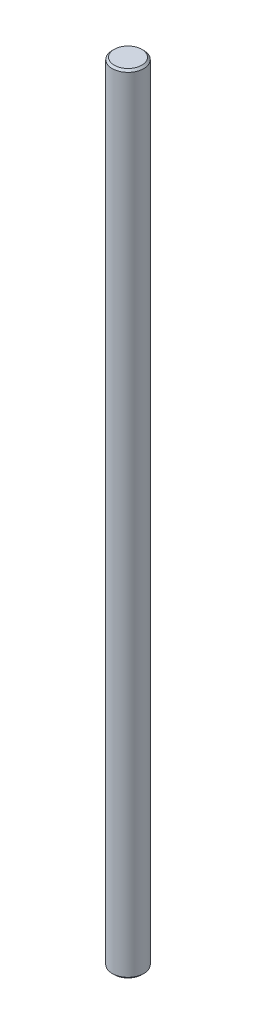
ISO-10303-21;
HEADER;
FILE_DESCRIPTION(('STEP AP214'),'2;1');
FILE_NAME('part.step','',(''),(''),'','','');
FILE_SCHEMA(('AUTOMOTIVE_DESIGN { 1 0 10303 214 1 1 1 1 }'));
ENDSEC;
DATA;
#1=APPLICATION_CONTEXT('core data for automotive mechanical design processes');
#2=APPLICATION_PROTOCOL_DEFINITION('international standard','automotive_design',2000,#1);
#3=PRODUCT_CONTEXT('',#1,'mechanical');
#4=PRODUCT('Part','Part','',(#3));
#5=PRODUCT_RELATED_PRODUCT_CATEGORY('part','',(#4));
#6=PRODUCT_DEFINITION_FORMATION('','',#4);
#7=PRODUCT_DEFINITION_CONTEXT('part definition',#1,'design');
#8=PRODUCT_DEFINITION('design','',#6,#7);
#9=PRODUCT_DEFINITION_SHAPE('','',#8);
#10=(LENGTH_UNIT() NAMED_UNIT(*) SI_UNIT(.MILLI.,.METRE.));
#11=(NAMED_UNIT(*) PLANE_ANGLE_UNIT() SI_UNIT($,.RADIAN.));
#12=(NAMED_UNIT(*) SI_UNIT($,.STERADIAN.) SOLID_ANGLE_UNIT());
#13=UNCERTAINTY_MEASURE_WITH_UNIT(LENGTH_MEASURE(1.E-05),#10,'distance_accuracy_value','');
#14=(GEOMETRIC_REPRESENTATION_CONTEXT(3) GLOBAL_UNCERTAINTY_ASSIGNED_CONTEXT((#13)) GLOBAL_UNIT_ASSIGNED_CONTEXT((#10,
#11,#12)) REPRESENTATION_CONTEXT('',''));
#15=CARTESIAN_POINT('',(0.,0.,0.));
#16=DIRECTION('',(0.,0.,1.));
#17=DIRECTION('',(1.,0.,0.));
#18=AXIS2_PLACEMENT_3D('',#15,#16,#17);
#19=CARTESIAN_POINT('',(0.,0.,0.));
#20=DIRECTION('',(0.,1.,0.));
#21=DIRECTION('',(1.,0.,0.));
#22=AXIS2_PLACEMENT_3D('',#19,#20,#21);
#23=PLANE('',#22);
#24=CARTESIAN_POINT('',(0.,0.,0.));
#25=DIRECTION('',(0.,-1.,0.));
#26=DIRECTION('',(-1.,0.,0.));
#27=AXIS2_PLACEMENT_3D('',#24,#25,#26);
#28=CIRCLE('',#27,3.5);
#29=CARTESIAN_POINT('',(-3.5,0.,0.));
#30=VERTEX_POINT('',#29);
#31=EDGE_CURVE('E11',#30,#30,#28,.T.);
#32=ORIENTED_EDGE('',*,*,#31,.T.);
#33=EDGE_LOOP('',(#32));
#34=FACE_BOUND('',#33,.T.);
#35=CARTESIAN_POINT('',(0.,0.,0.));
#36=DIRECTION('',(0.,-1.,0.));
#37=DIRECTION('',(1.,0.,0.));
#38=AXIS2_PLACEMENT_3D('',#35,#36,#37);
#39=CIRCLE('',#38,2.5);
#40=CARTESIAN_POINT('',(2.5,0.,0.));
#41=VERTEX_POINT('',#40);
#42=EDGE_CURVE('E70',#41,#41,#39,.T.);
#43=ORIENTED_EDGE('',*,*,#42,.F.);
#44=EDGE_LOOP('',(#43));
#45=FACE_BOUND('',#44,.T.);
#46=ADVANCED_FACE('F17',(#34,#45),#23,.F.);
#47=CARTESIAN_POINT('',(0.,0.2499999821202,0.));
#48=DIRECTION('',(0.,1.,0.));
#49=DIRECTION('',(0.,0.,-1.));
#50=AXIS2_PLACEMENT_3D('',#47,#48,#49);
#51=CONICAL_SURFACE('',#50,3.74999998212,0.7853981633973);
#52=CARTESIAN_POINT('',(0.,0.5,0.));
#53=DIRECTION('',(0.,-1.,0.));
#54=DIRECTION('',(1.,0.,0.));
#55=AXIS2_PLACEMENT_3D('',#52,#53,#54);
#56=CIRCLE('',#55,4.);
#57=CARTESIAN_POINT('',(4.,0.5,0.));
#58=VERTEX_POINT('',#57);
#59=EDGE_CURVE('E25',#58,#58,#56,.T.);
#60=ORIENTED_EDGE('',*,*,#59,.T.);
#61=EDGE_LOOP('',(#60));
#62=FACE_BOUND('',#61,.T.);
#63=ORIENTED_EDGE('',*,*,#31,.F.);
#64=EDGE_LOOP('',(#63));
#65=FACE_BOUND('',#64,.T.);
#66=ADVANCED_FACE('F40',(#62,#65),#51,.T.);
#67=CARTESIAN_POINT('',(0.,0.,0.));
#68=DIRECTION('',(0.,1.,0.));
#69=DIRECTION('',(1.,0.,0.));
#70=AXIS2_PLACEMENT_3D('',#67,#68,#69);
#71=CYLINDRICAL_SURFACE('',#70,4.);
#72=CARTESIAN_POINT('',(0.,199.5,0.));
#73=DIRECTION('',(0.,1.,0.));
#74=DIRECTION('',(1.,0.,0.));
#75=AXIS2_PLACEMENT_3D('',#72,#73,#74);
#76=CIRCLE('',#75,4.);
#77=CARTESIAN_POINT('',(4.,199.5,0.));
#78=VERTEX_POINT('',#77);
#79=EDGE_CURVE('E66',#78,#78,#76,.T.);
#80=ORIENTED_EDGE('',*,*,#79,.F.);
#81=EDGE_LOOP('',(#80));
#82=FACE_BOUND('',#81,.T.);
#83=ORIENTED_EDGE('',*,*,#59,.F.);
#84=EDGE_LOOP('',(#83));
#85=FACE_BOUND('',#84,.T.);
#86=ADVANCED_FACE('F46',(#82,#85),#71,.T.);
#87=CARTESIAN_POINT('',(0.,199.7500000179,0.));
#88=DIRECTION('',(0.,-1.,0.));
#89=DIRECTION('',(0.,0.,-1.));
#90=AXIS2_PLACEMENT_3D('',#87,#88,#89);
#91=CONICAL_SURFACE('',#90,3.74999998212,0.7853981633973);
#92=ORIENTED_EDGE('',*,*,#79,.T.);
#93=EDGE_LOOP('',(#92));
#94=FACE_BOUND('',#93,.T.);
#95=CARTESIAN_POINT('',(0.,200.,0.));
#96=DIRECTION('',(0.,1.,0.));
#97=DIRECTION('',(-1.,0.,0.));
#98=AXIS2_PLACEMENT_3D('',#95,#96,#97);
#99=CIRCLE('',#98,3.5);
#100=CARTESIAN_POINT('',(-3.5,200.,0.));
#101=VERTEX_POINT('',#100);
#102=EDGE_CURVE('E64',#101,#101,#99,.T.);
#103=ORIENTED_EDGE('',*,*,#102,.F.);
#104=EDGE_LOOP('',(#103));
#105=FACE_BOUND('',#104,.T.);
#106=ADVANCED_FACE('F53',(#94,#105),#91,.T.);
#107=CARTESIAN_POINT('',(0.,200.,0.));
#108=DIRECTION('',(0.,1.,0.));
#109=DIRECTION('',(1.,0.,0.));
#110=AXIS2_PLACEMENT_3D('',#107,#108,#109);
#111=PLANE('',#110);
#112=ORIENTED_EDGE('',*,*,#102,.T.);
#113=EDGE_LOOP('',(#112));
#114=FACE_BOUND('',#113,.T.);
#115=ADVANCED_FACE('F36',(#114),#111,.T.);
#116=CARTESIAN_POINT('',(0.,22.05225912495,0.));
#117=DIRECTION('',(0.,-1.,0.));
#118=DIRECTION('',(-1.,0.,0.));
#119=AXIS2_PLACEMENT_3D('',#116,#117,#118);
#120=CYLINDRICAL_SURFACE('',#119,2.5);
#121=ORIENTED_EDGE('',*,*,#42,.T.);
#122=EDGE_LOOP('',(#121));
#123=FACE_BOUND('',#122,.T.);
#124=CARTESIAN_POINT('',(0.,19.5,0.));
#125=DIRECTION('',(0.,-1.,0.));
#126=DIRECTION('',(-1.,0.,0.));
#127=AXIS2_PLACEMENT_3D('',#124,#125,#126);
#128=CIRCLE('',#127,2.5);
#129=CARTESIAN_POINT('',(-2.5,19.5,0.));
#130=VERTEX_POINT('',#129);
#131=EDGE_CURVE('E21',#130,#130,#128,.T.);
#132=ORIENTED_EDGE('',*,*,#131,.F.);
#133=EDGE_LOOP('',(#132));
#134=FACE_BOUND('',#133,.T.);
#135=ADVANCED_FACE('F30',(#123,#134),#120,.F.);
#136=CARTESIAN_POINT('',(0.,20.18917239644,0.));
#137=DIRECTION('',(0.,-1.,0.));
#138=DIRECTION('',(-1.,0.,0.));
#139=AXIS2_PLACEMENT_3D('',#136,#137,#138);
#140=CONICAL_SURFACE('',#139,1.353024520797,1.02974425867646);
#141=ORIENTED_EDGE('',*,*,#131,.T.);
#142=EDGE_LOOP('',(#141));
#143=FACE_BOUND('',#142,.T.);
#144=CARTESIAN_POINT('',(0.,21.00215154757,0.));
#145=VERTEX_POINT('',#144);
#146=VERTEX_LOOP('',#145);
#147=FACE_BOUND('',#146,.T.);
#148=ADVANCED_FACE('F19',(#143,#147),#140,.F.);
#149=CLOSED_SHELL('',(#46,#66,#86,#106,#115,#135,#148));
#150=MANIFOLD_SOLID_BREP('B1',#149);
#151=ADVANCED_BREP_SHAPE_REPRESENTATION('',(#18,#150),#14);
#152=SHAPE_DEFINITION_REPRESENTATION(#9,#151);
ENDSEC;
END-ISO-10303-21;
